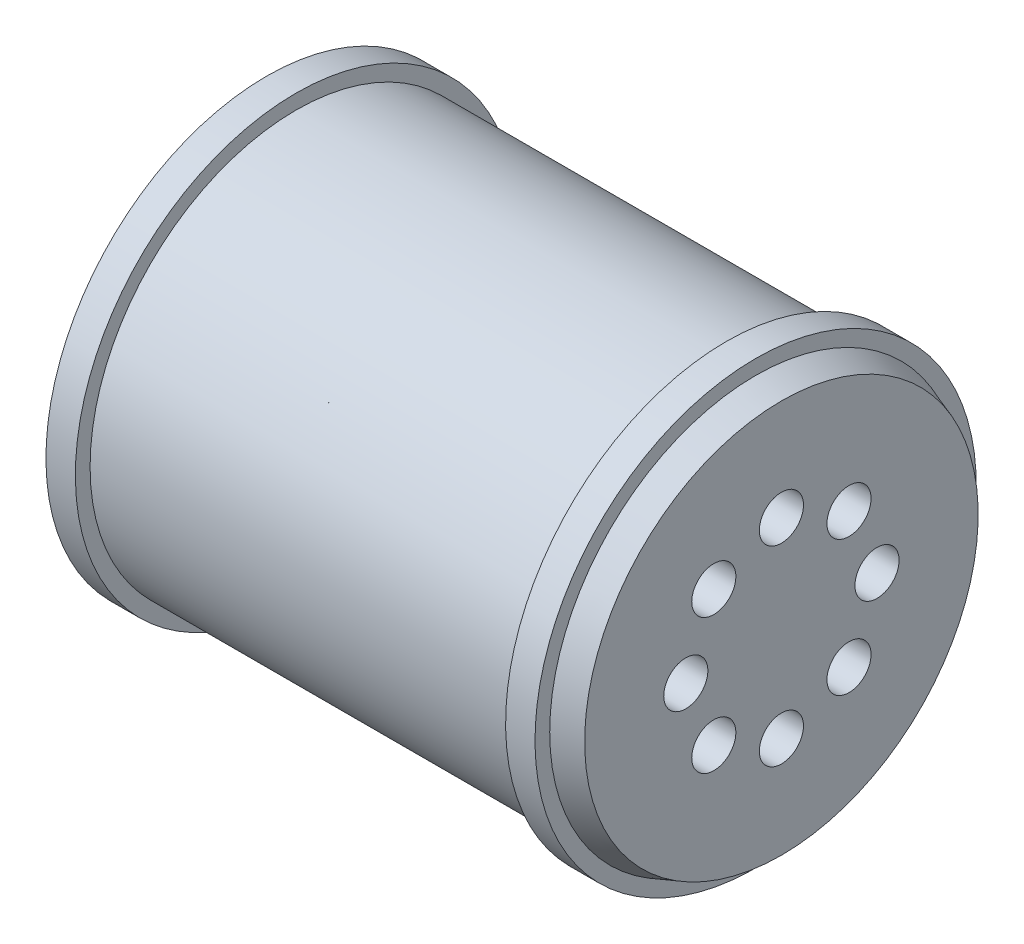
ISO-10303-21;
HEADER;
FILE_DESCRIPTION(('STEP AP214'),'2;1');
FILE_NAME('part.step','',(''),(''),'','','');
FILE_SCHEMA(('AUTOMOTIVE_DESIGN { 1 0 10303 214 1 1 1 1 }'));
ENDSEC;
DATA;
#1=APPLICATION_CONTEXT('core data for automotive mechanical design processes');
#2=APPLICATION_PROTOCOL_DEFINITION('international standard','automotive_design',2000,#1);
#3=PRODUCT_CONTEXT('',#1,'mechanical');
#4=PRODUCT('Part','Part','',(#3));
#5=PRODUCT_RELATED_PRODUCT_CATEGORY('part','',(#4));
#6=PRODUCT_DEFINITION_FORMATION('','',#4);
#7=PRODUCT_DEFINITION_CONTEXT('part definition',#1,'design');
#8=PRODUCT_DEFINITION('design','',#6,#7);
#9=PRODUCT_DEFINITION_SHAPE('','',#8);
#10=(LENGTH_UNIT() NAMED_UNIT(*) SI_UNIT(.MILLI.,.METRE.));
#11=(NAMED_UNIT(*) PLANE_ANGLE_UNIT() SI_UNIT($,.RADIAN.));
#12=(NAMED_UNIT(*) SI_UNIT($,.STERADIAN.) SOLID_ANGLE_UNIT());
#13=UNCERTAINTY_MEASURE_WITH_UNIT(LENGTH_MEASURE(1.E-05),#10,'distance_accuracy_value','');
#14=(GEOMETRIC_REPRESENTATION_CONTEXT(3) GLOBAL_UNCERTAINTY_ASSIGNED_CONTEXT((#13)) GLOBAL_UNIT_ASSIGNED_CONTEXT((#10,
#11,#12)) REPRESENTATION_CONTEXT('',''));
#15=CARTESIAN_POINT('',(0.,0.,0.));
#16=DIRECTION('',(0.,0.,1.));
#17=DIRECTION('',(1.,0.,0.));
#18=AXIS2_PLACEMENT_3D('',#15,#16,#17);
#19=CARTESIAN_POINT('',(18.2480240713641,13.3763807451425,0.));
#20=DIRECTION('',(1.,0.,0.));
#21=DIRECTION('',(0.,1.,0.));
#22=AXIS2_PLACEMENT_3D('',#19,#20,#21);
#23=PLANE('',#22);
#24=CARTESIAN_POINT('',(18.2480240713641,4.59619407771257,-4.59619407771255));
#25=DIRECTION('',(1.,0.,0.));
#26=DIRECTION('',(0.,1.,0.));
#27=AXIS2_PLACEMENT_3D('',#24,#25,#26);
#28=CIRCLE('',#27,1.5);
#29=CARTESIAN_POINT('',(18.2480240713641,6.09619407771257,-4.59619407771255));
#30=VERTEX_POINT('',#29);
#31=EDGE_CURVE('E151',#30,#30,#28,.T.);
#32=ORIENTED_EDGE('',*,*,#31,.F.);
#33=EDGE_LOOP('',(#32));
#34=FACE_BOUND('',#33,.T.);
#35=CARTESIAN_POINT('',(18.2480240713641,0.,-6.5));
#36=DIRECTION('',(1.,0.,0.));
#37=DIRECTION('',(0.,1.,0.));
#38=AXIS2_PLACEMENT_3D('',#35,#36,#37);
#39=CIRCLE('',#38,1.5);
#40=CARTESIAN_POINT('',(18.2480240713641,1.5,-6.5));
#41=VERTEX_POINT('',#40);
#42=EDGE_CURVE('E147',#41,#41,#39,.T.);
#43=ORIENTED_EDGE('',*,*,#42,.F.);
#44=EDGE_LOOP('',(#43));
#45=FACE_BOUND('',#44,.T.);
#46=CARTESIAN_POINT('',(18.2480240713641,-4.59619407771253,-4.59619407771258));
#47=DIRECTION('',(1.,0.,0.));
#48=DIRECTION('',(0.,1.,0.));
#49=AXIS2_PLACEMENT_3D('',#46,#47,#48);
#50=CIRCLE('',#49,1.5);
#51=CARTESIAN_POINT('',(18.2480240713641,-3.09619407771253,-4.59619407771258));
#52=VERTEX_POINT('',#51);
#53=EDGE_CURVE('E143',#52,#52,#50,.T.);
#54=ORIENTED_EDGE('',*,*,#53,.F.);
#55=EDGE_LOOP('',(#54));
#56=FACE_BOUND('',#55,.T.);
#57=CARTESIAN_POINT('',(18.2480240713641,-6.5,0.));
#58=DIRECTION('',(1.,0.,0.));
#59=DIRECTION('',(0.,1.,0.));
#60=AXIS2_PLACEMENT_3D('',#57,#58,#59);
#61=CIRCLE('',#60,1.5);
#62=CARTESIAN_POINT('',(18.2480240713641,-5.,0.));
#63=VERTEX_POINT('',#62);
#64=EDGE_CURVE('E139',#63,#63,#61,.T.);
#65=ORIENTED_EDGE('',*,*,#64,.F.);
#66=EDGE_LOOP('',(#65));
#67=FACE_BOUND('',#66,.T.);
#68=CARTESIAN_POINT('',(18.2480240713641,-4.59619407771257,4.59619407771255));
#69=DIRECTION('',(1.,0.,0.));
#70=DIRECTION('',(0.,1.,0.));
#71=AXIS2_PLACEMENT_3D('',#68,#69,#70);
#72=CIRCLE('',#71,1.5);
#73=CARTESIAN_POINT('',(18.2480240713641,-3.09619407771257,4.59619407771255));
#74=VERTEX_POINT('',#73);
#75=EDGE_CURVE('E135',#74,#74,#72,.T.);
#76=ORIENTED_EDGE('',*,*,#75,.F.);
#77=EDGE_LOOP('',(#76));
#78=FACE_BOUND('',#77,.T.);
#79=CARTESIAN_POINT('',(18.2480240713641,0.,6.5));
#80=DIRECTION('',(1.,0.,0.));
#81=DIRECTION('',(0.,1.,0.));
#82=AXIS2_PLACEMENT_3D('',#79,#80,#81);
#83=CIRCLE('',#82,1.5);
#84=CARTESIAN_POINT('',(18.2480240713641,1.5,6.5));
#85=VERTEX_POINT('',#84);
#86=EDGE_CURVE('E131',#85,#85,#83,.T.);
#87=ORIENTED_EDGE('',*,*,#86,.F.);
#88=EDGE_LOOP('',(#87));
#89=FACE_BOUND('',#88,.T.);
#90=CARTESIAN_POINT('',(18.2480240713641,4.59619407771253,4.59619407771258));
#91=DIRECTION('',(1.,0.,0.));
#92=DIRECTION('',(0.,1.,0.));
#93=AXIS2_PLACEMENT_3D('',#90,#91,#92);
#94=CIRCLE('',#93,1.5);
#95=CARTESIAN_POINT('',(18.2480240713641,6.09619407771254,4.59619407771258));
#96=VERTEX_POINT('',#95);
#97=EDGE_CURVE('E127',#96,#96,#94,.T.);
#98=ORIENTED_EDGE('',*,*,#97,.F.);
#99=EDGE_LOOP('',(#98));
#100=FACE_BOUND('',#99,.T.);
#101=CARTESIAN_POINT('',(18.2480240713641,6.5,0.));
#102=DIRECTION('',(1.,0.,0.));
#103=DIRECTION('',(0.,1.,0.));
#104=AXIS2_PLACEMENT_3D('',#101,#102,#103);
#105=CIRCLE('',#104,1.5);
#106=CARTESIAN_POINT('',(18.2480240713641,8.,0.));
#107=VERTEX_POINT('',#106);
#108=EDGE_CURVE('E123',#107,#107,#105,.T.);
#109=ORIENTED_EDGE('',*,*,#108,.F.);
#110=EDGE_LOOP('',(#109));
#111=FACE_BOUND('',#110,.T.);
#112=CARTESIAN_POINT('',(18.2480240713641,0.,0.));
#113=DIRECTION('',(1.,0.,0.));
#114=DIRECTION('',(0.,1.,0.));
#115=AXIS2_PLACEMENT_3D('',#112,#113,#114);
#116=CIRCLE('',#115,13.3763807451425);
#117=CARTESIAN_POINT('',(18.2480240713641,13.3763807451425,0.));
#118=VERTEX_POINT('',#117);
#119=EDGE_CURVE('E155',#118,#118,#116,.T.);
#120=ORIENTED_EDGE('',*,*,#119,.T.);
#121=EDGE_LOOP('',(#120));
#122=FACE_BOUND('',#121,.T.);
#123=ADVANCED_FACE('F41',(#34,#45,#56,#67,#78,#89,#100,#111,#122),#23,.T.);
#124=CARTESIAN_POINT('',(-8.75197592863589,0.,0.));
#125=DIRECTION('',(-1.,0.,0.));
#126=DIRECTION('',(0.,-1.,0.));
#127=AXIS2_PLACEMENT_3D('',#124,#125,#126);
#128=PLANE('',#127);
#129=CARTESIAN_POINT('',(-8.75197592863589,0.,0.));
#130=DIRECTION('',(-1.,0.,0.));
#131=DIRECTION('',(0.,-1.,0.));
#132=AXIS2_PLACEMENT_3D('',#129,#130,#131);
#133=CIRCLE('',#132,1.5);
#134=CARTESIAN_POINT('',(-8.75197592863589,1.25,0.82915619758885));
#135=VERTEX_POINT('',#134);
#136=CARTESIAN_POINT('',(-8.75197592863589,-1.25,0.82915619758885));
#137=VERTEX_POINT('',#136);
#138=EDGE_CURVE('E56',#135,#137,#133,.T.);
#139=ORIENTED_EDGE('',*,*,#138,.F.);
#140=DIRECTION('',(0.,1.,0.));
#141=VECTOR('',#140,1.);
#142=CARTESIAN_POINT('',(-8.75197592863589,1.25,0.82915619758885));
#143=LINE('',#142,#141);
#144=EDGE_CURVE('E77',#137,#135,#143,.T.);
#145=ORIENTED_EDGE('',*,*,#144,.F.);
#146=EDGE_LOOP('',(#139,#145));
#147=FACE_BOUND('',#146,.T.);
#148=CARTESIAN_POINT('',(-8.75197592863589,4.59619407771257,-4.59619407771255));
#149=DIRECTION('',(-1.,0.,0.));
#150=DIRECTION('',(0.,-1.,0.));
#151=AXIS2_PLACEMENT_3D('',#148,#149,#150);
#152=CIRCLE('',#151,1.5);
#153=CARTESIAN_POINT('',(-8.75197592863589,3.09619407771257,-4.59619407771255));
#154=VERTEX_POINT('',#153);
#155=EDGE_CURVE('E73',#154,#154,#152,.T.);
#156=ORIENTED_EDGE('',*,*,#155,.F.);
#157=EDGE_LOOP('',(#156));
#158=FACE_BOUND('',#157,.T.);
#159=CARTESIAN_POINT('',(-8.75197592863589,0.,-6.5));
#160=DIRECTION('',(-1.,0.,0.));
#161=DIRECTION('',(0.,-1.,0.));
#162=AXIS2_PLACEMENT_3D('',#159,#160,#161);
#163=CIRCLE('',#162,1.5);
#164=CARTESIAN_POINT('',(-8.75197592863589,-1.5,-6.5));
#165=VERTEX_POINT('',#164);
#166=EDGE_CURVE('E113',#165,#165,#163,.T.);
#167=ORIENTED_EDGE('',*,*,#166,.F.);
#168=EDGE_LOOP('',(#167));
#169=FACE_BOUND('',#168,.T.);
#170=CARTESIAN_POINT('',(-8.75197592863589,-4.59619407771253,-4.59619407771258));
#171=DIRECTION('',(-1.,0.,0.));
#172=DIRECTION('',(0.,-1.,0.));
#173=AXIS2_PLACEMENT_3D('',#170,#171,#172);
#174=CIRCLE('',#173,1.5);
#175=CARTESIAN_POINT('',(-8.75197592863589,-6.09619407771254,-4.59619407771258));
#176=VERTEX_POINT('',#175);
#177=EDGE_CURVE('E109',#176,#176,#174,.T.);
#178=ORIENTED_EDGE('',*,*,#177,.F.);
#179=EDGE_LOOP('',(#178));
#180=FACE_BOUND('',#179,.T.);
#181=CARTESIAN_POINT('',(-8.75197592863589,-6.5,0.));
#182=DIRECTION('',(-1.,0.,0.));
#183=DIRECTION('',(0.,-1.,0.));
#184=AXIS2_PLACEMENT_3D('',#181,#182,#183);
#185=CIRCLE('',#184,1.5);
#186=CARTESIAN_POINT('',(-8.75197592863589,-8.,0.));
#187=VERTEX_POINT('',#186);
#188=EDGE_CURVE('E105',#187,#187,#185,.T.);
#189=ORIENTED_EDGE('',*,*,#188,.F.);
#190=EDGE_LOOP('',(#189));
#191=FACE_BOUND('',#190,.T.);
#192=CARTESIAN_POINT('',(-8.75197592863589,-4.59619407771257,4.59619407771255));
#193=DIRECTION('',(-1.,0.,0.));
#194=DIRECTION('',(0.,-1.,0.));
#195=AXIS2_PLACEMENT_3D('',#192,#193,#194);
#196=CIRCLE('',#195,1.5);
#197=CARTESIAN_POINT('',(-8.75197592863589,-6.09619407771257,4.59619407771255));
#198=VERTEX_POINT('',#197);
#199=EDGE_CURVE('E101',#198,#198,#196,.T.);
#200=ORIENTED_EDGE('',*,*,#199,.F.);
#201=EDGE_LOOP('',(#200));
#202=FACE_BOUND('',#201,.T.);
#203=CARTESIAN_POINT('',(-8.75197592863589,0.,6.5));
#204=DIRECTION('',(-1.,0.,0.));
#205=DIRECTION('',(0.,-1.,0.));
#206=AXIS2_PLACEMENT_3D('',#203,#204,#205);
#207=CIRCLE('',#206,1.5);
#208=CARTESIAN_POINT('',(-8.75197592863589,-1.5,6.5));
#209=VERTEX_POINT('',#208);
#210=EDGE_CURVE('E97',#209,#209,#207,.T.);
#211=ORIENTED_EDGE('',*,*,#210,.F.);
#212=EDGE_LOOP('',(#211));
#213=FACE_BOUND('',#212,.T.);
#214=CARTESIAN_POINT('',(-8.75197592863589,4.59619407771253,4.59619407771258));
#215=DIRECTION('',(-1.,0.,0.));
#216=DIRECTION('',(0.,-1.,0.));
#217=AXIS2_PLACEMENT_3D('',#214,#215,#216);
#218=CIRCLE('',#217,1.5);
#219=CARTESIAN_POINT('',(-8.75197592863589,3.09619407771253,4.59619407771258));
#220=VERTEX_POINT('',#219);
#221=EDGE_CURVE('E92',#220,#220,#218,.T.);
#222=ORIENTED_EDGE('',*,*,#221,.F.);
#223=EDGE_LOOP('',(#222));
#224=FACE_BOUND('',#223,.T.);
#225=CARTESIAN_POINT('',(-8.75197592863589,6.5,0.));
#226=DIRECTION('',(-1.,0.,0.));
#227=DIRECTION('',(0.,-1.,0.));
#228=AXIS2_PLACEMENT_3D('',#225,#226,#227);
#229=CIRCLE('',#228,1.5);
#230=CARTESIAN_POINT('',(-8.75197592863589,5.,0.));
#231=VERTEX_POINT('',#230);
#232=EDGE_CURVE('E96',#231,#231,#229,.T.);
#233=ORIENTED_EDGE('',*,*,#232,.F.);
#234=EDGE_LOOP('',(#233));
#235=FACE_BOUND('',#234,.T.);
#236=CARTESIAN_POINT('',(-8.75197592863589,0.,0.));
#237=DIRECTION('',(1.,0.,0.));
#238=DIRECTION('',(0.,1.,0.));
#239=AXIS2_PLACEMENT_3D('',#236,#237,#238);
#240=CIRCLE('',#239,8.5);
#241=CARTESIAN_POINT('',(-8.75197592863589,8.5,0.));
#242=VERTEX_POINT('',#241);
#243=EDGE_CURVE('E11',#242,#242,#240,.T.);
#244=ORIENTED_EDGE('',*,*,#243,.F.);
#245=EDGE_LOOP('',(#244));
#246=FACE_BOUND('',#245,.T.);
#247=ADVANCED_FACE('F82',(#147,#158,#169,#180,#191,#202,#213,#224,#235,#246),#128,.T.);
#248=CARTESIAN_POINT('',(18.2480240713641,0.,0.));
#249=DIRECTION('',(1.,0.,0.));
#250=DIRECTION('',(0.,1.,0.));
#251=AXIS2_PLACEMENT_3D('',#248,#249,#250);
#252=CYLINDRICAL_SURFACE('',#251,8.5);
#253=ORIENTED_EDGE('',*,*,#243,.T.);
#254=EDGE_LOOP('',(#253));
#255=FACE_BOUND('',#254,.T.);
#256=CARTESIAN_POINT('',(-16.7519759286359,0.,0.));
#257=DIRECTION('',(1.,0.,0.));
#258=DIRECTION('',(0.,1.,0.));
#259=AXIS2_PLACEMENT_3D('',#256,#257,#258);
#260=CIRCLE('',#259,8.5);
#261=CARTESIAN_POINT('',(-16.7519759286359,8.5,0.));
#262=VERTEX_POINT('',#261);
#263=EDGE_CURVE('E49',#262,#262,#260,.T.);
#264=ORIENTED_EDGE('',*,*,#263,.F.);
#265=EDGE_LOOP('',(#264));
#266=FACE_BOUND('',#265,.T.);
#267=ADVANCED_FACE('F193',(#255,#266),#252,.F.);
#268=CARTESIAN_POINT('',(-16.7519759286359,8.5,0.));
#269=DIRECTION('',(-1.,0.,0.));
#270=DIRECTION('',(0.,-1.,0.));
#271=AXIS2_PLACEMENT_3D('',#268,#269,#270);
#272=PLANE('',#271);
#273=ORIENTED_EDGE('',*,*,#263,.T.);
#274=EDGE_LOOP('',(#273));
#275=FACE_BOUND('',#274,.T.);
#276=CARTESIAN_POINT('',(-16.7519759286359,0.,0.));
#277=DIRECTION('',(1.,0.,0.));
#278=DIRECTION('',(0.,1.,0.));
#279=AXIS2_PLACEMENT_3D('',#276,#277,#278);
#280=CIRCLE('',#279,15.);
#281=CARTESIAN_POINT('',(-16.7519759286359,15.,0.));
#282=VERTEX_POINT('',#281);
#283=EDGE_CURVE('E183',#282,#282,#280,.T.);
#284=ORIENTED_EDGE('',*,*,#283,.F.);
#285=EDGE_LOOP('',(#284));
#286=FACE_BOUND('',#285,.T.);
#287=ADVANCED_FACE('F190',(#275,#286),#272,.T.);
#288=CARTESIAN_POINT('',(18.2480240713641,0.,0.));
#289=DIRECTION('',(1.,0.,0.));
#290=DIRECTION('',(0.,1.,0.));
#291=AXIS2_PLACEMENT_3D('',#288,#289,#290);
#292=CYLINDRICAL_SURFACE('',#291,15.);
#293=ORIENTED_EDGE('',*,*,#283,.T.);
#294=EDGE_LOOP('',(#293));
#295=FACE_BOUND('',#294,.T.);
#296=CARTESIAN_POINT('',(-14.7519759286359,0.,0.));
#297=DIRECTION('',(1.,0.,0.));
#298=DIRECTION('',(0.,1.,0.));
#299=AXIS2_PLACEMENT_3D('',#296,#297,#298);
#300=CIRCLE('',#299,15.);
#301=CARTESIAN_POINT('',(-14.7519759286359,15.,0.));
#302=VERTEX_POINT('',#301);
#303=EDGE_CURVE('E179',#302,#302,#300,.T.);
#304=ORIENTED_EDGE('',*,*,#303,.F.);
#305=EDGE_LOOP('',(#304));
#306=FACE_BOUND('',#305,.T.);
#307=ADVANCED_FACE('F201',(#295,#306),#292,.T.);
#308=CARTESIAN_POINT('',(-14.7519759286359,15.,0.));
#309=DIRECTION('',(1.,0.,0.));
#310=DIRECTION('',(0.,1.,0.));
#311=AXIS2_PLACEMENT_3D('',#308,#309,#310);
#312=PLANE('',#311);
#313=ORIENTED_EDGE('',*,*,#303,.T.);
#314=EDGE_LOOP('',(#313));
#315=FACE_BOUND('',#314,.T.);
#316=CARTESIAN_POINT('',(-14.7519759286359,0.,0.));
#317=DIRECTION('',(1.,0.,0.));
#318=DIRECTION('',(0.,1.,0.));
#319=AXIS2_PLACEMENT_3D('',#316,#317,#318);
#320=CIRCLE('',#319,14.);
#321=CARTESIAN_POINT('',(-14.7519759286359,14.,0.));
#322=VERTEX_POINT('',#321);
#323=EDGE_CURVE('E175',#322,#322,#320,.T.);
#324=ORIENTED_EDGE('',*,*,#323,.F.);
#325=EDGE_LOOP('',(#324));
#326=FACE_BOUND('',#325,.T.);
#327=ADVANCED_FACE('F253',(#315,#326),#312,.T.);
#328=CARTESIAN_POINT('',(18.2480240713641,0.,0.));
#329=DIRECTION('',(1.,0.,0.));
#330=DIRECTION('',(0.,1.,0.));
#331=AXIS2_PLACEMENT_3D('',#328,#329,#330);
#332=CYLINDRICAL_SURFACE('',#331,14.);
#333=ORIENTED_EDGE('',*,*,#323,.T.);
#334=EDGE_LOOP('',(#333));
#335=FACE_BOUND('',#334,.T.);
#336=CARTESIAN_POINT('',(14.4963141217797,0.,0.));
#337=DIRECTION('',(1.,0.,0.));
#338=DIRECTION('',(0.,1.,0.));
#339=AXIS2_PLACEMENT_3D('',#336,#337,#338);
#340=CIRCLE('',#339,14.);
#341=CARTESIAN_POINT('',(14.4963141217797,14.,0.));
#342=VERTEX_POINT('',#341);
#343=EDGE_CURVE('E171',#342,#342,#340,.T.);
#344=ORIENTED_EDGE('',*,*,#343,.F.);
#345=EDGE_LOOP('',(#344));
#346=FACE_BOUND('',#345,.T.);
#347=ADVANCED_FACE('F249',(#335,#346),#332,.T.);
#348=CARTESIAN_POINT('',(14.4963141217797,14.,0.));
#349=DIRECTION('',(-1.,0.,0.));
#350=DIRECTION('',(0.,-1.,0.));
#351=AXIS2_PLACEMENT_3D('',#348,#349,#350);
#352=PLANE('',#351);
#353=ORIENTED_EDGE('',*,*,#343,.T.);
#354=EDGE_LOOP('',(#353));
#355=FACE_BOUND('',#354,.T.);
#356=CARTESIAN_POINT('',(14.4963141217797,0.,0.));
#357=DIRECTION('',(1.,0.,0.));
#358=DIRECTION('',(0.,1.,0.));
#359=AXIS2_PLACEMENT_3D('',#356,#357,#358);
#360=CIRCLE('',#359,15.);
#361=CARTESIAN_POINT('',(14.4963141217797,15.,0.));
#362=VERTEX_POINT('',#361);
#363=EDGE_CURVE('E167',#362,#362,#360,.T.);
#364=ORIENTED_EDGE('',*,*,#363,.F.);
#365=EDGE_LOOP('',(#364));
#366=FACE_BOUND('',#365,.T.);
#367=ADVANCED_FACE('F245',(#355,#366),#352,.T.);
#368=CARTESIAN_POINT('',(18.2480240713641,0.,0.));
#369=DIRECTION('',(1.,0.,0.));
#370=DIRECTION('',(0.,1.,0.));
#371=AXIS2_PLACEMENT_3D('',#368,#369,#370);
#372=CYLINDRICAL_SURFACE('',#371,15.);
#373=ORIENTED_EDGE('',*,*,#363,.T.);
#374=EDGE_LOOP('',(#373));
#375=FACE_BOUND('',#374,.T.);
#376=CARTESIAN_POINT('',(16.4963141217797,0.,0.));
#377=DIRECTION('',(1.,0.,0.));
#378=DIRECTION('',(0.,1.,0.));
#379=AXIS2_PLACEMENT_3D('',#376,#377,#378);
#380=CIRCLE('',#379,15.);
#381=CARTESIAN_POINT('',(16.4963141217797,15.,0.));
#382=VERTEX_POINT('',#381);
#383=EDGE_CURVE('E163',#382,#382,#380,.T.);
#384=ORIENTED_EDGE('',*,*,#383,.F.);
#385=EDGE_LOOP('',(#384));
#386=FACE_BOUND('',#385,.T.);
#387=ADVANCED_FACE('F238',(#375,#386),#372,.T.);
#388=CARTESIAN_POINT('',(16.4963141217797,15.,0.));
#389=DIRECTION('',(1.,0.,0.));
#390=DIRECTION('',(0.,1.,0.));
#391=AXIS2_PLACEMENT_3D('',#388,#389,#390);
#392=PLANE('',#391);
#393=ORIENTED_EDGE('',*,*,#383,.T.);
#394=EDGE_LOOP('',(#393));
#395=FACE_BOUND('',#394,.T.);
#396=CARTESIAN_POINT('',(16.4963141217797,0.,0.));
#397=DIRECTION('',(1.,0.,0.));
#398=DIRECTION('',(0.,1.,0.));
#399=AXIS2_PLACEMENT_3D('',#396,#397,#398);
#400=CIRCLE('',#399,14.);
#401=CARTESIAN_POINT('',(16.4963141217797,14.,0.));
#402=VERTEX_POINT('',#401);
#403=EDGE_CURVE('E159',#402,#402,#400,.T.);
#404=ORIENTED_EDGE('',*,*,#403,.F.);
#405=EDGE_LOOP('',(#404));
#406=FACE_BOUND('',#405,.T.);
#407=ADVANCED_FACE('F228',(#395,#406),#392,.T.);
#408=CARTESIAN_POINT('',(18.2480240713641,0.,0.));
#409=DIRECTION('',(-1.,0.,0.));
#410=DIRECTION('',(0.,-1.,0.));
#411=AXIS2_PLACEMENT_3D('',#408,#409,#410);
#412=CONICAL_SURFACE('',#411,13.3763807451425,0.34201532546563);
#413=ORIENTED_EDGE('',*,*,#403,.T.);
#414=EDGE_LOOP('',(#413));
#415=FACE_BOUND('',#414,.T.);
#416=ORIENTED_EDGE('',*,*,#119,.F.);
#417=EDGE_LOOP('',(#416));
#418=FACE_BOUND('',#417,.T.);
#419=ADVANCED_FACE('F225',(#415,#418),#412,.T.);
#420=CARTESIAN_POINT('',(23.2480240713641,6.5,0.));
#421=DIRECTION('',(-1.,0.,0.));
#422=DIRECTION('',(0.,-1.,0.));
#423=AXIS2_PLACEMENT_3D('',#420,#421,#422);
#424=CYLINDRICAL_SURFACE('',#423,1.5);
#425=ORIENTED_EDGE('',*,*,#108,.T.);
#426=EDGE_LOOP('',(#425));
#427=FACE_BOUND('',#426,.T.);
#428=ORIENTED_EDGE('',*,*,#232,.T.);
#429=EDGE_LOOP('',(#428));
#430=FACE_BOUND('',#429,.T.);
#431=ADVANCED_FACE('F227',(#427,#430),#424,.F.);
#432=CARTESIAN_POINT('',(23.2480240713641,4.59619407771253,4.59619407771258));
#433=DIRECTION('',(-1.,0.,0.));
#434=DIRECTION('',(0.,-1.,0.));
#435=AXIS2_PLACEMENT_3D('',#432,#433,#434);
#436=CYLINDRICAL_SURFACE('',#435,1.5);
#437=ORIENTED_EDGE('',*,*,#97,.T.);
#438=EDGE_LOOP('',(#437));
#439=FACE_BOUND('',#438,.T.);
#440=ORIENTED_EDGE('',*,*,#221,.T.);
#441=EDGE_LOOP('',(#440));
#442=FACE_BOUND('',#441,.T.);
#443=ADVANCED_FACE('F235',(#439,#442),#436,.F.);
#444=CARTESIAN_POINT('',(23.2480240713641,0.,6.5));
#445=DIRECTION('',(-1.,0.,0.));
#446=DIRECTION('',(0.,-1.,0.));
#447=AXIS2_PLACEMENT_3D('',#444,#445,#446);
#448=CYLINDRICAL_SURFACE('',#447,1.5);
#449=ORIENTED_EDGE('',*,*,#86,.T.);
#450=EDGE_LOOP('',(#449));
#451=FACE_BOUND('',#450,.T.);
#452=ORIENTED_EDGE('',*,*,#210,.T.);
#453=EDGE_LOOP('',(#452));
#454=FACE_BOUND('',#453,.T.);
#455=ADVANCED_FACE('F321',(#451,#454),#448,.F.);
#456=CARTESIAN_POINT('',(23.2480240713641,-4.59619407771257,4.59619407771255));
#457=DIRECTION('',(-1.,0.,0.));
#458=DIRECTION('',(0.,-1.,0.));
#459=AXIS2_PLACEMENT_3D('',#456,#457,#458);
#460=CYLINDRICAL_SURFACE('',#459,1.5);
#461=ORIENTED_EDGE('',*,*,#75,.T.);
#462=EDGE_LOOP('',(#461));
#463=FACE_BOUND('',#462,.T.);
#464=ORIENTED_EDGE('',*,*,#199,.T.);
#465=EDGE_LOOP('',(#464));
#466=FACE_BOUND('',#465,.T.);
#467=ADVANCED_FACE('F331',(#463,#466),#460,.F.);
#468=CARTESIAN_POINT('',(23.2480240713641,-6.5,0.));
#469=DIRECTION('',(-1.,0.,0.));
#470=DIRECTION('',(0.,-1.,0.));
#471=AXIS2_PLACEMENT_3D('',#468,#469,#470);
#472=CYLINDRICAL_SURFACE('',#471,1.5);
#473=ORIENTED_EDGE('',*,*,#64,.T.);
#474=EDGE_LOOP('',(#473));
#475=FACE_BOUND('',#474,.T.);
#476=ORIENTED_EDGE('',*,*,#188,.T.);
#477=EDGE_LOOP('',(#476));
#478=FACE_BOUND('',#477,.T.);
#479=ADVANCED_FACE('F341',(#475,#478),#472,.F.);
#480=CARTESIAN_POINT('',(23.2480240713641,-4.59619407771253,-4.59619407771258));
#481=DIRECTION('',(-1.,0.,0.));
#482=DIRECTION('',(0.,-1.,0.));
#483=AXIS2_PLACEMENT_3D('',#480,#481,#482);
#484=CYLINDRICAL_SURFACE('',#483,1.5);
#485=ORIENTED_EDGE('',*,*,#53,.T.);
#486=EDGE_LOOP('',(#485));
#487=FACE_BOUND('',#486,.T.);
#488=ORIENTED_EDGE('',*,*,#177,.T.);
#489=EDGE_LOOP('',(#488));
#490=FACE_BOUND('',#489,.T.);
#491=ADVANCED_FACE('F351',(#487,#490),#484,.F.);
#492=CARTESIAN_POINT('',(23.2480240713641,0.,-6.5));
#493=DIRECTION('',(-1.,0.,0.));
#494=DIRECTION('',(0.,-1.,0.));
#495=AXIS2_PLACEMENT_3D('',#492,#493,#494);
#496=CYLINDRICAL_SURFACE('',#495,1.5);
#497=ORIENTED_EDGE('',*,*,#42,.T.);
#498=EDGE_LOOP('',(#497));
#499=FACE_BOUND('',#498,.T.);
#500=ORIENTED_EDGE('',*,*,#166,.T.);
#501=EDGE_LOOP('',(#500));
#502=FACE_BOUND('',#501,.T.);
#503=ADVANCED_FACE('F361',(#499,#502),#496,.F.);
#504=CARTESIAN_POINT('',(23.2480240713641,4.59619407771257,-4.59619407771255));
#505=DIRECTION('',(-1.,0.,0.));
#506=DIRECTION('',(0.,-1.,0.));
#507=AXIS2_PLACEMENT_3D('',#504,#505,#506);
#508=CYLINDRICAL_SURFACE('',#507,1.5);
#509=ORIENTED_EDGE('',*,*,#31,.T.);
#510=EDGE_LOOP('',(#509));
#511=FACE_BOUND('',#510,.T.);
#512=ORIENTED_EDGE('',*,*,#155,.T.);
#513=EDGE_LOOP('',(#512));
#514=FACE_BOUND('',#513,.T.);
#515=ADVANCED_FACE('F371',(#511,#514),#508,.F.);
#516=CARTESIAN_POINT('',(1.24802407136411,0.,0.));
#517=DIRECTION('',(-1.,0.,0.));
#518=DIRECTION('',(0.,-1.,0.));
#519=AXIS2_PLACEMENT_3D('',#516,#517,#518);
#520=CYLINDRICAL_SURFACE('',#519,1.5);
#521=ORIENTED_EDGE('',*,*,#138,.T.);
#522=DIRECTION('',(-1.,0.,0.));
#523=VECTOR('',#522,1.);
#524=CARTESIAN_POINT('',(1.24802407136411,-1.25,0.82915619758885));
#525=LINE('',#524,#523);
#526=CARTESIAN_POINT('',(1.24802407136411,-1.25,0.82915619758885));
#527=VERTEX_POINT('',#526);
#528=EDGE_CURVE('E74',#527,#137,#525,.T.);
#529=ORIENTED_EDGE('',*,*,#528,.F.);
#530=CARTESIAN_POINT('',(1.24802407136411,0.,0.));
#531=DIRECTION('',(-1.,0.,0.));
#532=DIRECTION('',(0.,-1.,0.));
#533=AXIS2_PLACEMENT_3D('',#530,#531,#532);
#534=CIRCLE('',#533,1.5);
#535=CARTESIAN_POINT('',(1.24802407136411,1.25,0.82915619758885));
#536=VERTEX_POINT('',#535);
#537=EDGE_CURVE('E70',#536,#527,#534,.T.);
#538=ORIENTED_EDGE('',*,*,#537,.F.);
#539=DIRECTION('',(-1.,0.,0.));
#540=VECTOR('',#539,1.);
#541=CARTESIAN_POINT('',(1.24802407136411,1.25,0.82915619758885));
#542=LINE('',#541,#540);
#543=EDGE_CURVE('E64',#536,#135,#542,.T.);
#544=ORIENTED_EDGE('',*,*,#543,.T.);
#545=EDGE_LOOP('',(#521,#529,#538,#544));
#546=FACE_BOUND('',#545,.T.);
#547=ADVANCED_FACE('F68',(#546),#520,.F.);
#548=CARTESIAN_POINT('',(1.24802407136411,1.25,0.82915619758885));
#549=DIRECTION('',(0.,0.,1.));
#550=DIRECTION('',(1.,0.,0.));
#551=AXIS2_PLACEMENT_3D('',#548,#549,#550);
#552=PLANE('',#551);
#553=ORIENTED_EDGE('',*,*,#144,.T.);
#554=ORIENTED_EDGE('',*,*,#543,.F.);
#555=DIRECTION('',(0.,1.,0.));
#556=VECTOR('',#555,1.);
#557=CARTESIAN_POINT('',(1.24802407136411,1.25,0.82915619758885));
#558=LINE('',#557,#556);
#559=EDGE_CURVE('E87',#527,#536,#558,.T.);
#560=ORIENTED_EDGE('',*,*,#559,.F.);
#561=ORIENTED_EDGE('',*,*,#528,.T.);
#562=EDGE_LOOP('',(#553,#554,#560,#561));
#563=FACE_BOUND('',#562,.T.);
#564=ADVANCED_FACE('F78',(#563),#552,.F.);
#565=CARTESIAN_POINT('',(1.24802407136411,0.,0.));
#566=DIRECTION('',(-1.,0.,0.));
#567=DIRECTION('',(0.,-1.,0.));
#568=AXIS2_PLACEMENT_3D('',#565,#566,#567);
#569=PLANE('',#568);
#570=ORIENTED_EDGE('',*,*,#537,.T.);
#571=ORIENTED_EDGE('',*,*,#559,.T.);
#572=EDGE_LOOP('',(#570,#571));
#573=FACE_BOUND('',#572,.T.);
#574=ADVANCED_FACE('F403',(#573),#569,.T.);
#575=CLOSED_SHELL('',(#123,#247,#267,#287,#307,#327,#347,#367,#387,#407,#419,#431,#443,#455,
#467,#479,#491,#503,#515,#547,#564,#574));
#576=MANIFOLD_SOLID_BREP('B2',#575);
#577=ADVANCED_BREP_SHAPE_REPRESENTATION('',(#18,#576),#14);
#578=SHAPE_DEFINITION_REPRESENTATION(#9,#577);
ENDSEC;
END-ISO-10303-21;
